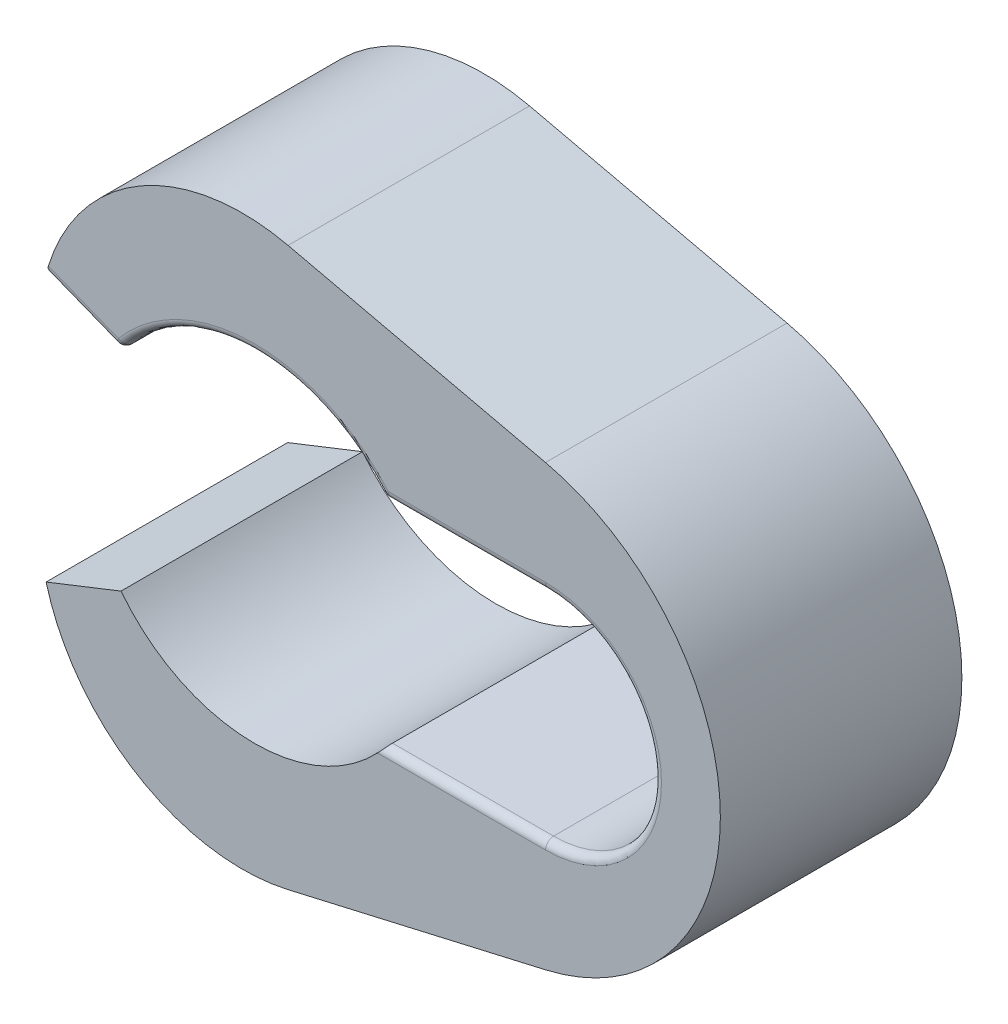
ISO-10303-21;
HEADER;
FILE_DESCRIPTION(('STEP AP214'),'2;1');
FILE_NAME('part.step','',(''),(''),'','','');
FILE_SCHEMA(('AUTOMOTIVE_DESIGN { 1 0 10303 214 1 1 1 1 }'));
ENDSEC;
DATA;
#1=APPLICATION_CONTEXT('core data for automotive mechanical design processes');
#2=APPLICATION_PROTOCOL_DEFINITION('international standard','automotive_design',2000,#1);
#3=PRODUCT_CONTEXT('',#1,'mechanical');
#4=PRODUCT('Part','Part','',(#3));
#5=PRODUCT_RELATED_PRODUCT_CATEGORY('part','',(#4));
#6=PRODUCT_DEFINITION_FORMATION('','',#4);
#7=PRODUCT_DEFINITION_CONTEXT('part definition',#1,'design');
#8=PRODUCT_DEFINITION('design','',#6,#7);
#9=PRODUCT_DEFINITION_SHAPE('','',#8);
#10=(LENGTH_UNIT() NAMED_UNIT(*) SI_UNIT(.MILLI.,.METRE.));
#11=(NAMED_UNIT(*) PLANE_ANGLE_UNIT() SI_UNIT($,.RADIAN.));
#12=(NAMED_UNIT(*) SI_UNIT($,.STERADIAN.) SOLID_ANGLE_UNIT());
#13=UNCERTAINTY_MEASURE_WITH_UNIT(LENGTH_MEASURE(1.E-05),#10,'distance_accuracy_value','');
#14=(GEOMETRIC_REPRESENTATION_CONTEXT(3) GLOBAL_UNCERTAINTY_ASSIGNED_CONTEXT((#13)) GLOBAL_UNIT_ASSIGNED_CONTEXT((#10,
#11,#12)) REPRESENTATION_CONTEXT('',''));
#15=CARTESIAN_POINT('',(0.,0.,0.));
#16=DIRECTION('',(0.,0.,1.));
#17=DIRECTION('',(1.,0.,0.));
#18=AXIS2_PLACEMENT_3D('',#15,#16,#17);
#19=CARTESIAN_POINT('',(0.,0.,15.));
#20=DIRECTION('',(0.,0.,-1.));
#21=DIRECTION('',(-1.,0.,0.));
#22=AXIS2_PLACEMENT_3D('',#19,#20,#21);
#23=CYLINDRICAL_SURFACE('',#22,10.5);
#24=CARTESIAN_POINT('',(0.,0.,14.5));
#25=DIRECTION('',(0.,0.,-1.));
#26=DIRECTION('',(-1.,0.,0.));
#27=AXIS2_PLACEMENT_3D('',#24,#25,#26);
#28=CIRCLE('',#27,10.5);
#29=CARTESIAN_POINT('',(7.93823782931141,6.87272727272728,14.5));
#30=VERTEX_POINT('',#29);
#31=CARTESIAN_POINT('',(-8.05579356416953,6.73455195625402,14.5));
#32=VERTEX_POINT('',#31);
#33=EDGE_CURVE('E43',#30,#32,#28,.F.);
#34=ORIENTED_EDGE('',*,*,#33,.T.);
#35=DIRECTION('',(0.,0.,-1.));
#36=VECTOR('',#35,1.);
#37=CARTESIAN_POINT('',(-8.05579356416953,6.73455195625402,15.));
#38=LINE('',#37,#36);
#39=CARTESIAN_POINT('',(-8.05579356416953,6.73455195625402,0.5));
#40=VERTEX_POINT('',#39);
#41=EDGE_CURVE('E11',#32,#40,#38,.T.);
#42=ORIENTED_EDGE('',*,*,#41,.T.);
#43=CARTESIAN_POINT('',(0.,0.,0.5));
#44=DIRECTION('',(0.,0.,-1.));
#45=DIRECTION('',(-1.,0.,0.));
#46=AXIS2_PLACEMENT_3D('',#43,#44,#45);
#47=CIRCLE('',#46,10.5);
#48=CARTESIAN_POINT('',(7.93823782931141,6.87272727272728,0.5));
#49=VERTEX_POINT('',#48);
#50=EDGE_CURVE('E335',#40,#49,#47,.T.);
#51=ORIENTED_EDGE('',*,*,#50,.T.);
#52=DIRECTION('',(0.,0.,-1.));
#53=VECTOR('',#52,1.);
#54=CARTESIAN_POINT('',(7.93823782931141,6.87272727272728,15.));
#55=LINE('',#54,#53);
#56=EDGE_CURVE('E54',#49,#30,#55,.F.);
#57=ORIENTED_EDGE('',*,*,#56,.T.);
#58=EDGE_LOOP('',(#34,#42,#51,#57));
#59=FACE_BOUND('',#58,.T.);
#60=ADVANCED_FACE('F33',(#59),#23,.F.);
#61=CARTESIAN_POINT('',(8.08455317256309,6.7,15.));
#62=DIRECTION('',(0.,1.,0.));
#63=DIRECTION('',(0.,0.,1.));
#64=AXIS2_PLACEMENT_3D('',#61,#62,#63);
#65=PLANE('',#64);
#66=DIRECTION('',(0.,0.,-1.));
#67=VECTOR('',#66,1.);
#68=CARTESIAN_POINT('',(18.0845531725631,6.7,15.));
#69=LINE('',#68,#67);
#70=CARTESIAN_POINT('',(18.0845531725631,6.7,14.5));
#71=VERTEX_POINT('',#70);
#72=CARTESIAN_POINT('',(18.0845531725631,6.7,0.5));
#73=VERTEX_POINT('',#72);
#74=EDGE_CURVE('E244',#71,#73,#69,.T.);
#75=ORIENTED_EDGE('',*,*,#74,.F.);
#76=DIRECTION('',(1.,0.,0.));
#77=VECTOR('',#76,1.);
#78=CARTESIAN_POINT('',(8.08455317256309,6.7,14.5));
#79=LINE('',#78,#77);
#80=CARTESIAN_POINT('',(8.31624915451671,6.7,14.5));
#81=VERTEX_POINT('',#80);
#82=EDGE_CURVE('E437',#71,#81,#79,.F.);
#83=ORIENTED_EDGE('',*,*,#82,.T.);
#84=DIRECTION('',(0.,0.,-1.));
#85=VECTOR('',#84,1.);
#86=CARTESIAN_POINT('',(8.31624915451671,6.7,15.));
#87=LINE('',#86,#85);
#88=CARTESIAN_POINT('',(8.31624915451671,6.7,0.5));
#89=VERTEX_POINT('',#88);
#90=EDGE_CURVE('E433',#81,#89,#87,.T.);
#91=ORIENTED_EDGE('',*,*,#90,.T.);
#92=DIRECTION('',(1.,0.,0.));
#93=VECTOR('',#92,1.);
#94=CARTESIAN_POINT('',(18.0845531725631,6.7,0.5));
#95=LINE('',#94,#93);
#96=EDGE_CURVE('E435',#89,#73,#95,.T.);
#97=ORIENTED_EDGE('',*,*,#96,.T.);
#98=EDGE_LOOP('',(#75,#83,#91,#97));
#99=FACE_BOUND('',#98,.T.);
#100=ADVANCED_FACE('F281',(#99),#65,.F.);
#101=CARTESIAN_POINT('',(18.0845531725631,0.,15.));
#102=DIRECTION('',(0.,0.,-1.));
#103=DIRECTION('',(-1.,0.,0.));
#104=AXIS2_PLACEMENT_3D('',#101,#102,#103);
#105=CYLINDRICAL_SURFACE('',#104,6.7);
#106=DIRECTION('',(0.,0.,-1.));
#107=VECTOR('',#106,1.);
#108=CARTESIAN_POINT('',(18.0845531725631,-6.7,15.));
#109=LINE('',#108,#107);
#110=CARTESIAN_POINT('',(18.0845531725631,-6.7,14.5));
#111=VERTEX_POINT('',#110);
#112=CARTESIAN_POINT('',(18.0845531725631,-6.7,0.5));
#113=VERTEX_POINT('',#112);
#114=EDGE_CURVE('E241',#111,#113,#109,.T.);
#115=ORIENTED_EDGE('',*,*,#114,.F.);
#116=CARTESIAN_POINT('',(18.0845531725631,0.,14.5));
#117=DIRECTION('',(0.,0.,-1.));
#118=DIRECTION('',(-1.,0.,0.));
#119=AXIS2_PLACEMENT_3D('',#116,#117,#118);
#120=CIRCLE('',#119,6.7);
#121=EDGE_CURVE('E424',#111,#71,#120,.F.);
#122=ORIENTED_EDGE('',*,*,#121,.T.);
#123=ORIENTED_EDGE('',*,*,#74,.T.);
#124=CARTESIAN_POINT('',(18.0845531725631,0.,0.5));
#125=DIRECTION('',(0.,0.,-1.));
#126=DIRECTION('',(-1.,0.,0.));
#127=AXIS2_PLACEMENT_3D('',#124,#125,#126);
#128=CIRCLE('',#127,6.7);
#129=EDGE_CURVE('E411',#73,#113,#128,.T.);
#130=ORIENTED_EDGE('',*,*,#129,.T.);
#131=EDGE_LOOP('',(#115,#122,#123,#130));
#132=FACE_BOUND('',#131,.T.);
#133=ADVANCED_FACE('F277',(#132),#105,.F.);
#134=CARTESIAN_POINT('',(8.0845531725631,-6.7,15.));
#135=DIRECTION('',(0.,-1.,0.));
#136=DIRECTION('',(1.,0.,0.));
#137=AXIS2_PLACEMENT_3D('',#134,#135,#136);
#138=PLANE('',#137);
#139=DIRECTION('',(0.,0.,-1.));
#140=VECTOR('',#139,1.);
#141=CARTESIAN_POINT('',(8.08455317256309,-6.70000000000001,15.));
#142=LINE('',#141,#140);
#143=CARTESIAN_POINT('',(8.08455317256309,-6.70000000000001,14.5));
#144=VERTEX_POINT('',#143);
#145=CARTESIAN_POINT('',(8.08455317256309,-6.70000000000001,0.5));
#146=VERTEX_POINT('',#145);
#147=EDGE_CURVE('E194',#144,#146,#142,.T.);
#148=ORIENTED_EDGE('',*,*,#147,.F.);
#149=DIRECTION('',(-1.,0.,0.));
#150=VECTOR('',#149,1.);
#151=CARTESIAN_POINT('',(8.0845531725631,-6.7,14.5));
#152=LINE('',#151,#150);
#153=EDGE_CURVE('E420',#144,#111,#152,.F.);
#154=ORIENTED_EDGE('',*,*,#153,.T.);
#155=ORIENTED_EDGE('',*,*,#114,.T.);
#156=DIRECTION('',(-1.,0.,0.));
#157=VECTOR('',#156,1.);
#158=CARTESIAN_POINT('',(8.08455317256309,-6.7,0.5));
#159=LINE('',#158,#157);
#160=EDGE_CURVE('E418',#113,#146,#159,.T.);
#161=ORIENTED_EDGE('',*,*,#160,.T.);
#162=EDGE_LOOP('',(#148,#154,#155,#161));
#163=FACE_BOUND('',#162,.T.);
#164=ADVANCED_FACE('F272',(#163),#138,.F.);
#165=CARTESIAN_POINT('',(0.,0.,15.));
#166=DIRECTION('',(0.,0.,-1.));
#167=DIRECTION('',(-1.,0.,0.));
#168=AXIS2_PLACEMENT_3D('',#165,#166,#167);
#169=CYLINDRICAL_SURFACE('',#168,10.5);
#170=CARTESIAN_POINT('',(0.,0.,15.));
#171=DIRECTION('',(0.,0.,-1.));
#172=DIRECTION('',(1.,0.,0.));
#173=AXIS2_PLACEMENT_3D('',#170,#171,#172);
#174=CIRCLE('',#173,10.5);
#175=CARTESIAN_POINT('',(7.6426435217142,-7.2,15.));
#176=VERTEX_POINT('',#175);
#177=CARTESIAN_POINT('',(-8.28130836625724,-6.45522515044657,15.));
#178=VERTEX_POINT('',#177);
#179=EDGE_CURVE('E176',#176,#178,#174,.T.);
#180=ORIENTED_EDGE('',*,*,#179,.F.);
#181=CARTESIAN_POINT('',(7.6426435217142,-7.2,15.));
#182=CARTESIAN_POINT('',(7.67145457104155,-7.16942996802068,14.999977280342));
#183=CARTESIAN_POINT('',(7.70012696283523,-7.13861534813409,14.9971906104281));
#184=CARTESIAN_POINT('',(7.75677183624732,-7.07701966692438,14.9856673290246));
#185=CARTESIAN_POINT('',(7.78473708628821,-7.04624075461462,14.9768843342326));
#186=CARTESIAN_POINT('',(7.83625956917391,-6.98887515371483,14.9541749552461));
#187=CARTESIAN_POINT('',(7.85997333778086,-6.96218447579508,14.9408756179153));
#188=CARTESIAN_POINT('',(7.90542638702153,-6.9105287255696,14.9088117622525));
#189=CARTESIAN_POINT('',(7.92717103595549,-6.88555900887289,14.8900627278632));
#190=CARTESIAN_POINT('',(7.96327886611879,-6.84373990013145,14.8516998615106));
#191=CARTESIAN_POINT('',(7.9782020575658,-6.82632752327069,14.8332297678906));
#192=CARTESIAN_POINT('',(8.00583793064208,-6.79389514958017,14.7928271969774));
#193=CARTESIAN_POINT('',(8.01855249611813,-6.77887311483652,14.7708977011523));
#194=CARTESIAN_POINT('',(8.03917576639338,-6.75439594752188,14.7279003040597));
#195=CARTESIAN_POINT('',(8.04753551746968,-6.74442718464261,14.7073424707738));
#196=CARTESIAN_POINT('',(8.06192148113246,-6.72722435640947,14.6643686331708));
#197=CARTESIAN_POINT('',(8.06795188770199,-6.71998537664666,14.6419560575341));
#198=CARTESIAN_POINT('',(8.07654649557036,-6.70965246487634,14.5997339233324));
#199=CARTESIAN_POINT('',(8.07952567161257,-6.70606308293382,14.5801295703303));
#200=CARTESIAN_POINT('',(8.08354023935213,-6.70122226116396,14.5403596879494));
#201=CARTESIAN_POINT('',(8.08456760743836,-6.69998047206649,14.52019218648));
#202=CARTESIAN_POINT('',(8.08455317256309,-6.7,14.5));
#203=B_SPLINE_CURVE_WITH_KNOTS('',3,(#181,#182,#183,#184,#185,#186,#187,#188,#189,#190,#191,
#192,#193,#194,#195,#196,#197,#198,#199,#200,#201,#202),.UNSPECIFIED.,.F.,.F.,(4,2,2,2,2,2,2,2,
2,2,4),(0.,0.126064658014748,0.253115678898471,0.367005597267162,0.480575037395884,
0.568591487515284,0.656532491416228,0.729223194543934,0.801782401167014,0.862006614552694,
0.922477870076368),.UNSPECIFIED.);
#204=EDGE_CURVE('E262',#176,#144,#203,.T.);
#205=ORIENTED_EDGE('',*,*,#204,.T.);
#206=ORIENTED_EDGE('',*,*,#147,.T.);
#207=CARTESIAN_POINT('',(8.08455317256309,-6.7,0.5));
#208=CARTESIAN_POINT('',(8.08458037578323,-6.69996348631527,0.476509477331905));
#209=CARTESIAN_POINT('',(8.08318341593196,-6.70165287219748,0.453060772565229));
#210=CARTESIAN_POINT('',(8.07777138201821,-6.70817709876669,0.407069745262832));
#211=CARTESIAN_POINT('',(8.07377377472908,-6.71299095403427,0.384522433477553));
#212=CARTESIAN_POINT('',(8.06339442082013,-6.72545399488196,0.340865342524354));
#213=CARTESIAN_POINT('',(8.05701687786426,-6.73309818108317,0.31975310586245));
#214=CARTESIAN_POINT('',(8.0421968383729,-6.75079286507141,0.279317490257493));
#215=CARTESIAN_POINT('',(8.03375089617154,-6.76084737753071,0.259997171217162));
#216=CARTESIAN_POINT('',(8.01221925809003,-6.78636121775907,0.217708647155055));
#217=CARTESIAN_POINT('',(7.9985082959306,-6.80252786022017,0.195485346296694));
#218=CARTESIAN_POINT('',(7.96880902896444,-6.83729535901345,0.154798355422256));
#219=CARTESIAN_POINT('',(7.95281762975984,-6.85589952005958,0.136339858078292));
#220=CARTESIAN_POINT('',(7.91399861000451,-6.90070619924002,0.0980856862502893));
#221=CARTESIAN_POINT('',(7.89057147274189,-6.92749822390498,0.0795922216383028));
#222=CARTESIAN_POINT('',(7.84174153441776,-6.98272562337612,0.0485595516525926));
#223=CARTESIAN_POINT('',(7.81633428783464,-7.01116465684693,0.0360342211257642));
#224=CARTESIAN_POINT('',(7.76638708297808,-7.06643475877294,0.0173593490184483));
#225=CARTESIAN_POINT('',(7.74194310924323,-7.09320991035824,0.0107761663891884));
#226=CARTESIAN_POINT('',(7.69258461067551,-7.14671121976606,0.00211955409466551));
#227=CARTESIAN_POINT('',(7.66767457678755,-7.17343640883009,1.48823626316069E-05));
#228=CARTESIAN_POINT('',(7.6426435217142,-7.2,0.));
#229=B_SPLINE_CURVE_WITH_KNOTS('',3,(#207,#208,#209,#210,#211,#212,#213,#214,#215,#216,#217,
#218,#219,#220,#221,#222,#223,#224,#225,#226,#227,#228),.UNSPECIFIED.,.F.,.F.,(4,2,2,2,2,2,2,2,
2,2,4),(0.,0.0703032742388482,0.140139177371983,0.20985230921604,0.279682372990529,
0.371318734345133,0.463080644574803,0.582764627529044,0.702725512969597,0.812986647473504,
0.922476044589817),.UNSPECIFIED.);
#230=CARTESIAN_POINT('',(7.6426435217142,-7.2,0.));
#231=VERTEX_POINT('',#230);
#232=EDGE_CURVE('E256',#146,#231,#229,.T.);
#233=ORIENTED_EDGE('',*,*,#232,.T.);
#234=CARTESIAN_POINT('',(0.,0.,0.));
#235=DIRECTION('',(0.,0.,-1.));
#236=DIRECTION('',(1.,0.,0.));
#237=AXIS2_PLACEMENT_3D('',#234,#235,#236);
#238=CIRCLE('',#237,10.5);
#239=CARTESIAN_POINT('',(-8.28130836625724,-6.45522515044657,0.));
#240=VERTEX_POINT('',#239);
#241=EDGE_CURVE('E191',#231,#240,#238,.T.);
#242=ORIENTED_EDGE('',*,*,#241,.T.);
#243=DIRECTION('',(0.,0.,-1.));
#244=VECTOR('',#243,1.);
#245=CARTESIAN_POINT('',(-8.28130836625724,-6.45522515044657,15.));
#246=LINE('',#245,#244);
#247=EDGE_CURVE('E188',#178,#240,#246,.T.);
#248=ORIENTED_EDGE('',*,*,#247,.F.);
#249=EDGE_LOOP('',(#180,#205,#206,#233,#242,#248));
#250=FACE_BOUND('',#249,.T.);
#251=ADVANCED_FACE('F189',(#250),#169,.F.);
#252=CARTESIAN_POINT('',(-8.28130836625724,-6.45522515044657,15.));
#253=DIRECTION('',(0.367329900760933,-0.930090718159774,0.));
#254=DIRECTION('',(0.930090718159774,0.367329900760933,0.));
#255=AXIS2_PLACEMENT_3D('',#252,#253,#254);
#256=PLANE('',#255);
#257=DIRECTION('',(-0.930090718159773,-0.367329900760933,0.));
#258=VECTOR('',#257,1.);
#259=CARTESIAN_POINT('',(-8.28130836625724,-6.45522515044657,0.));
#260=LINE('',#259,#258);
#261=CARTESIAN_POINT('',(-12.9317619570561,-8.29187465425124,0.));
#262=VERTEX_POINT('',#261);
#263=EDGE_CURVE('E215',#240,#262,#260,.T.);
#264=ORIENTED_EDGE('',*,*,#263,.T.);
#265=DIRECTION('',(0.,0.,-1.));
#266=VECTOR('',#265,1.);
#267=CARTESIAN_POINT('',(-12.9317619570561,-8.29187465425124,15.));
#268=LINE('',#267,#266);
#269=CARTESIAN_POINT('',(-12.9317619570561,-8.29187465425124,15.));
#270=VERTEX_POINT('',#269);
#271=EDGE_CURVE('E195',#270,#262,#268,.T.);
#272=ORIENTED_EDGE('',*,*,#271,.F.);
#273=DIRECTION('',(-0.930090718159773,-0.367329900760933,0.));
#274=VECTOR('',#273,1.);
#275=CARTESIAN_POINT('',(-8.28130836625724,-6.45522515044657,15.));
#276=LINE('',#275,#274);
#277=EDGE_CURVE('E180',#178,#270,#276,.T.);
#278=ORIENTED_EDGE('',*,*,#277,.F.);
#279=ORIENTED_EDGE('',*,*,#247,.T.);
#280=EDGE_LOOP('',(#264,#272,#278,#279));
#281=FACE_BOUND('',#280,.T.);
#282=ADVANCED_FACE('F197',(#281),#256,.F.);
#283=CARTESIAN_POINT('',(-0.739697046897969,-5.02607362365075,15.));
#284=DIRECTION('',(0.,0.,-1.));
#285=DIRECTION('',(-1.,0.,0.));
#286=AXIS2_PLACEMENT_3D('',#283,#284,#285);
#287=CYLINDRICAL_SURFACE('',#286,12.6218819177245);
#288=CARTESIAN_POINT('',(-0.739697046897969,-5.02607362365075,0.));
#289=DIRECTION('',(0.,0.,1.));
#290=DIRECTION('',(-1.,0.,0.));
#291=AXIS2_PLACEMENT_3D('',#288,#289,#290);
#292=CIRCLE('',#291,12.6218819177245);
#293=CARTESIAN_POINT('',(2.0931964355167,-17.3259361294787,0.));
#294=VERTEX_POINT('',#293);
#295=EDGE_CURVE('E217',#262,#294,#292,.T.);
#296=ORIENTED_EDGE('',*,*,#295,.T.);
#297=DIRECTION('',(0.,0.,-1.));
#298=VECTOR('',#297,1.);
#299=CARTESIAN_POINT('',(2.0931964355167,-17.3259361294787,15.));
#300=LINE('',#299,#298);
#301=CARTESIAN_POINT('',(2.0931964355167,-17.3259361294787,15.));
#302=VERTEX_POINT('',#301);
#303=EDGE_CURVE('E235',#302,#294,#300,.T.);
#304=ORIENTED_EDGE('',*,*,#303,.F.);
#305=CARTESIAN_POINT('',(-0.739697046897969,-5.02607362365075,15.));
#306=DIRECTION('',(0.,0.,1.));
#307=DIRECTION('',(-1.,0.,0.));
#308=AXIS2_PLACEMENT_3D('',#305,#306,#307);
#309=CIRCLE('',#308,12.6218819177245);
#310=EDGE_CURVE('E200',#270,#302,#309,.T.);
#311=ORIENTED_EDGE('',*,*,#310,.F.);
#312=ORIENTED_EDGE('',*,*,#271,.T.);
#313=EDGE_LOOP('',(#296,#304,#311,#312));
#314=FACE_BOUND('',#313,.T.);
#315=ADVANCED_FACE('F521',(#314),#287,.T.);
#316=CARTESIAN_POINT('',(2.0931964355167,-17.3259361294787,15.));
#317=DIRECTION('',(-0.224443034793134,0.974487210861614,0.));
#318=DIRECTION('',(-0.974487210861614,-0.224443034793134,0.));
#319=AXIS2_PLACEMENT_3D('',#316,#317,#318);
#320=PLANE('',#319);
#321=DIRECTION('',(0.974487210861614,0.224443034793134,0.));
#322=VECTOR('',#321,1.);
#323=CARTESIAN_POINT('',(2.0931964355167,-17.3259361294787,0.));
#324=LINE('',#323,#322);
#325=CARTESIAN_POINT('',(18.0845531725631,-13.6428209520626,0.));
#326=VERTEX_POINT('',#325);
#327=EDGE_CURVE('E219',#294,#326,#324,.T.);
#328=ORIENTED_EDGE('',*,*,#327,.T.);
#329=DIRECTION('',(0.,0.,-1.));
#330=VECTOR('',#329,1.);
#331=CARTESIAN_POINT('',(18.0845531725631,-13.6428209520626,15.));
#332=LINE('',#331,#330);
#333=CARTESIAN_POINT('',(18.0845531725631,-13.6428209520626,15.));
#334=VERTEX_POINT('',#333);
#335=EDGE_CURVE('E232',#334,#326,#332,.T.);
#336=ORIENTED_EDGE('',*,*,#335,.F.);
#337=DIRECTION('',(0.974487210861614,0.224443034793134,0.));
#338=VECTOR('',#337,1.);
#339=CARTESIAN_POINT('',(2.0931964355167,-17.3259361294787,15.));
#340=LINE('',#339,#338);
#341=EDGE_CURVE('E202',#302,#334,#340,.T.);
#342=ORIENTED_EDGE('',*,*,#341,.F.);
#343=ORIENTED_EDGE('',*,*,#303,.T.);
#344=EDGE_LOOP('',(#328,#336,#342,#343));
#345=FACE_BOUND('',#344,.T.);
#346=ADVANCED_FACE('F528',(#345),#320,.F.);
#347=CARTESIAN_POINT('',(14.9423506854592,0.,15.));
#348=DIRECTION('',(0.,0.,-1.));
#349=DIRECTION('',(-1.,0.,0.));
#350=AXIS2_PLACEMENT_3D('',#347,#348,#349);
#351=CYLINDRICAL_SURFACE('',#350,14.);
#352=CARTESIAN_POINT('',(14.9423506854592,0.,0.));
#353=DIRECTION('',(0.,0.,1.));
#354=DIRECTION('',(-1.,0.,0.));
#355=AXIS2_PLACEMENT_3D('',#352,#353,#354);
#356=CIRCLE('',#355,14.);
#357=CARTESIAN_POINT('',(18.0845531725631,13.6428209520626,0.));
#358=VERTEX_POINT('',#357);
#359=EDGE_CURVE('E221',#326,#358,#356,.T.);
#360=ORIENTED_EDGE('',*,*,#359,.T.);
#361=DIRECTION('',(0.,0.,-1.));
#362=VECTOR('',#361,1.);
#363=CARTESIAN_POINT('',(18.0845531725631,13.6428209520626,15.));
#364=LINE('',#363,#362);
#365=CARTESIAN_POINT('',(18.0845531725631,13.6428209520626,15.));
#366=VERTEX_POINT('',#365);
#367=EDGE_CURVE('E229',#366,#358,#364,.T.);
#368=ORIENTED_EDGE('',*,*,#367,.F.);
#369=CARTESIAN_POINT('',(14.9423506854592,0.,15.));
#370=DIRECTION('',(0.,0.,1.));
#371=DIRECTION('',(-1.,0.,0.));
#372=AXIS2_PLACEMENT_3D('',#369,#370,#371);
#373=CIRCLE('',#372,14.);
#374=EDGE_CURVE('E206',#334,#366,#373,.T.);
#375=ORIENTED_EDGE('',*,*,#374,.F.);
#376=ORIENTED_EDGE('',*,*,#335,.T.);
#377=EDGE_LOOP('',(#360,#368,#375,#376));
#378=FACE_BOUND('',#377,.T.);
#379=ADVANCED_FACE('F531',(#378),#351,.T.);
#380=CARTESIAN_POINT('',(2.0931964355167,17.3259361294787,15.));
#381=DIRECTION('',(-0.224443034793134,-0.974487210861614,0.));
#382=DIRECTION('',(0.974487210861614,-0.224443034793134,0.));
#383=AXIS2_PLACEMENT_3D('',#380,#381,#382);
#384=PLANE('',#383);
#385=DIRECTION('',(-0.974487210861614,0.224443034793134,0.));
#386=VECTOR('',#385,1.);
#387=CARTESIAN_POINT('',(2.0931964355167,17.3259361294787,0.));
#388=LINE('',#387,#386);
#389=CARTESIAN_POINT('',(2.09319643551671,17.3259361294787,0.));
#390=VERTEX_POINT('',#389);
#391=EDGE_CURVE('E223',#358,#390,#388,.T.);
#392=ORIENTED_EDGE('',*,*,#391,.T.);
#393=DIRECTION('',(0.,0.,-1.));
#394=VECTOR('',#393,1.);
#395=CARTESIAN_POINT('',(2.09319643551671,17.3259361294787,15.));
#396=LINE('',#395,#394);
#397=CARTESIAN_POINT('',(2.09319643551671,17.3259361294787,15.));
#398=VERTEX_POINT('',#397);
#399=EDGE_CURVE('E213',#398,#390,#396,.T.);
#400=ORIENTED_EDGE('',*,*,#399,.F.);
#401=DIRECTION('',(-0.974487210861614,0.224443034793134,0.));
#402=VECTOR('',#401,1.);
#403=CARTESIAN_POINT('',(2.0931964355167,17.3259361294787,15.));
#404=LINE('',#403,#402);
#405=EDGE_CURVE('E208',#366,#398,#404,.T.);
#406=ORIENTED_EDGE('',*,*,#405,.F.);
#407=ORIENTED_EDGE('',*,*,#367,.T.);
#408=EDGE_LOOP('',(#392,#400,#406,#407));
#409=FACE_BOUND('',#408,.T.);
#410=ADVANCED_FACE('F345',(#409),#384,.F.);
#411=CARTESIAN_POINT('',(-0.739697046897969,5.02607362365075,15.));
#412=DIRECTION('',(0.,0.,-1.));
#413=DIRECTION('',(-1.,0.,0.));
#414=AXIS2_PLACEMENT_3D('',#411,#412,#413);
#415=CYLINDRICAL_SURFACE('',#414,12.6218819177245);
#416=DIRECTION('',(0.,0.,-1.));
#417=VECTOR('',#416,1.);
#418=CARTESIAN_POINT('',(-12.8036876798747,8.73714262764808,15.));
#419=LINE('',#418,#417);
#420=CARTESIAN_POINT('',(-12.8036876798747,8.73714262764808,0.00150887155019215));
#421=VERTEX_POINT('',#420);
#422=CARTESIAN_POINT('',(-12.8036876798747,8.73714262764808,14.9984911284498));
#423=VERTEX_POINT('',#422);
#424=EDGE_CURVE('E336',#421,#423,#419,.F.);
#425=ORIENTED_EDGE('',*,*,#424,.T.);
#426=CARTESIAN_POINT('',(-12.8036876798747,8.73714262764808,14.9984911284498));
#427=CARTESIAN_POINT('',(-12.8017829761243,8.74333451406577,14.9989939633457));
#428=CARTESIAN_POINT('',(-12.7998720538441,8.74952957615502,14.9993711200895));
#429=CARTESIAN_POINT('',(-12.796037772224,8.76192605167667,14.9998740772729));
#430=CARTESIAN_POINT('',(-12.7941144128842,8.76812746510907,14.9999998777125));
#431=CARTESIAN_POINT('',(-12.7921848350146,8.77433205421304,15.));
#432=B_SPLINE_CURVE_WITH_KNOTS('',3,(#426,#427,#428,#429,#430,#431),.UNSPECIFIED.,.F.,.F.,(4,2,
4),(0.,0.0194821453937151,0.0389642907874283),.UNSPECIFIED.);
#433=CARTESIAN_POINT('',(-12.7921848350146,8.77433205421304,15.));
#434=VERTEX_POINT('',#433);
#435=EDGE_CURVE('E328',#423,#434,#432,.T.);
#436=ORIENTED_EDGE('',*,*,#435,.T.);
#437=CARTESIAN_POINT('',(-0.739697046897969,5.02607362365075,15.));
#438=DIRECTION('',(0.,0.,1.));
#439=DIRECTION('',(1.,0.,0.));
#440=AXIS2_PLACEMENT_3D('',#437,#438,#439);
#441=CIRCLE('',#440,12.6218819177245);
#442=EDGE_CURVE('E210',#398,#434,#441,.T.);
#443=ORIENTED_EDGE('',*,*,#442,.F.);
#444=ORIENTED_EDGE('',*,*,#399,.T.);
#445=CARTESIAN_POINT('',(-0.739697046897969,5.02607362365075,0.));
#446=DIRECTION('',(0.,0.,1.));
#447=DIRECTION('',(1.,0.,0.));
#448=AXIS2_PLACEMENT_3D('',#445,#446,#447);
#449=CIRCLE('',#448,12.6218819177245);
#450=CARTESIAN_POINT('',(-12.7921848350145,8.77433205421304,0.));
#451=VERTEX_POINT('',#450);
#452=EDGE_CURVE('E185',#390,#451,#449,.T.);
#453=ORIENTED_EDGE('',*,*,#452,.T.);
#454=CARTESIAN_POINT('',(-12.7921848350145,8.77433205421304,0.));
#455=CARTESIAN_POINT('',(-12.7941144128842,8.76812746510907,1.22287527018651E-07));
#456=CARTESIAN_POINT('',(-12.796037772224,8.76192605167667,0.000125922727139839));
#457=CARTESIAN_POINT('',(-12.7998720538441,8.74952957615502,0.00062887991053708));
#458=CARTESIAN_POINT('',(-12.8017829761243,8.74333451406576,0.0010060366543215));
#459=CARTESIAN_POINT('',(-12.8036876798747,8.73714262764808,0.00150887155019172));
#460=B_SPLINE_CURVE_WITH_KNOTS('',3,(#454,#455,#456,#457,#458,#459),.UNSPECIFIED.,.F.,.F.,(4,2,
4),(0.,0.0194821453937159,0.0389642907874316),.UNSPECIFIED.);
#461=EDGE_CURVE('E350',#451,#421,#460,.T.);
#462=ORIENTED_EDGE('',*,*,#461,.T.);
#463=EDGE_LOOP('',(#425,#436,#443,#444,#453,#462));
#464=FACE_BOUND('',#463,.T.);
#465=ADVANCED_FACE('F339',(#464),#415,.T.);
#466=CARTESIAN_POINT('',(-8.28130836625724,6.45522515044656,15.));
#467=DIRECTION('',(0.367329900760933,0.930090718159774,0.));
#468=DIRECTION('',(-0.930090718159774,0.367329900760933,0.));
#469=AXIS2_PLACEMENT_3D('',#466,#467,#468);
#470=PLANE('',#469);
#471=DIRECTION('',(0.930090718159774,-0.367329900760933,0.));
#472=VECTOR('',#471,1.);
#473=CARTESIAN_POINT('',(-8.28130836625724,6.45522515044656,14.5));
#474=LINE('',#473,#472);
#475=CARTESIAN_POINT('',(-8.62306773189141,6.59019954747194,14.5));
#476=VERTEX_POINT('',#475);
#477=CARTESIAN_POINT('',(-12.5094527928294,8.12508793080906,14.5));
#478=VERTEX_POINT('',#477);
#479=EDGE_CURVE('E442',#476,#478,#474,.F.);
#480=ORIENTED_EDGE('',*,*,#479,.T.);
#481=DIRECTION('',(0.,0.,-1.));
#482=VECTOR('',#481,1.);
#483=CARTESIAN_POINT('',(-12.5094527928294,8.12508793080906,15.));
#484=LINE('',#483,#482);
#485=CARTESIAN_POINT('',(-12.5094527928294,8.12508793080906,0.5));
#486=VERTEX_POINT('',#485);
#487=EDGE_CURVE('E355',#478,#486,#484,.T.);
#488=ORIENTED_EDGE('',*,*,#487,.T.);
#489=DIRECTION('',(0.930090718159774,-0.367329900760933,0.));
#490=VECTOR('',#489,1.);
#491=CARTESIAN_POINT('',(-8.28130836625724,6.45522515044656,0.5));
#492=LINE('',#491,#490);
#493=CARTESIAN_POINT('',(-8.62306773189141,6.59019954747194,0.5));
#494=VERTEX_POINT('',#493);
#495=EDGE_CURVE('E441',#486,#494,#492,.T.);
#496=ORIENTED_EDGE('',*,*,#495,.T.);
#497=DIRECTION('',(0.,0.,-1.));
#498=VECTOR('',#497,1.);
#499=CARTESIAN_POINT('',(-8.62306773189141,6.59019954747194,15.));
#500=LINE('',#499,#498);
#501=EDGE_CURVE('E439',#494,#476,#500,.F.);
#502=ORIENTED_EDGE('',*,*,#501,.T.);
#503=EDGE_LOOP('',(#480,#488,#496,#502));
#504=FACE_BOUND('',#503,.T.);
#505=ADVANCED_FACE('F344',(#504),#470,.F.);
#506=CARTESIAN_POINT('',(0.,0.,15.));
#507=DIRECTION('',(0.,0.,-1.));
#508=DIRECTION('',(-1.,0.,0.));
#509=AXIS2_PLACEMENT_3D('',#506,#507,#508);
#510=PLANE('',#509);
#511=CARTESIAN_POINT('',(18.0845531725631,0.,15.));
#512=DIRECTION('',(0.,0.,-1.));
#513=DIRECTION('',(-1.,0.,0.));
#514=AXIS2_PLACEMENT_3D('',#511,#512,#513);
#515=CIRCLE('',#514,7.2);
#516=CARTESIAN_POINT('',(18.0845531725631,7.2,15.));
#517=VERTEX_POINT('',#516);
#518=CARTESIAN_POINT('',(18.0845531725631,-7.2,15.));
#519=VERTEX_POINT('',#518);
#520=EDGE_CURVE('E253',#517,#519,#515,.T.);
#521=ORIENTED_EDGE('',*,*,#520,.T.);
#522=DIRECTION('',(-1.,0.,0.));
#523=VECTOR('',#522,1.);
#524=CARTESIAN_POINT('',(0.,-7.20000000000001,15.));
#525=LINE('',#524,#523);
#526=EDGE_CURVE('E183',#519,#176,#525,.T.);
#527=ORIENTED_EDGE('',*,*,#526,.T.);
#528=ORIENTED_EDGE('',*,*,#179,.T.);
#529=ORIENTED_EDGE('',*,*,#277,.T.);
#530=ORIENTED_EDGE('',*,*,#310,.T.);
#531=ORIENTED_EDGE('',*,*,#341,.T.);
#532=ORIENTED_EDGE('',*,*,#374,.T.);
#533=ORIENTED_EDGE('',*,*,#405,.T.);
#534=ORIENTED_EDGE('',*,*,#442,.T.);
#535=DIRECTION('',(0.930090718159774,-0.367329900760933,0.));
#536=VECTOR('',#535,1.);
#537=CARTESIAN_POINT('',(1.27168613083324,3.21994878241698,15.));
#538=LINE('',#537,#536);
#539=CARTESIAN_POINT('',(-8.43940278151094,7.05524490655183,15.));
#540=VERTEX_POINT('',#539);
#541=EDGE_CURVE('E249',#434,#540,#538,.T.);
#542=ORIENTED_EDGE('',*,*,#541,.T.);
#543=CARTESIAN_POINT('',(0.,0.,15.));
#544=DIRECTION('',(0.,0.,-1.));
#545=DIRECTION('',(-1.,0.,0.));
#546=AXIS2_PLACEMENT_3D('',#543,#544,#545);
#547=CIRCLE('',#546,11.);
#548=CARTESIAN_POINT('',(8.31624915451671,7.2,15.));
#549=VERTEX_POINT('',#548);
#550=EDGE_CURVE('E247',#540,#549,#547,.T.);
#551=ORIENTED_EDGE('',*,*,#550,.T.);
#552=DIRECTION('',(1.,0.,0.));
#553=VECTOR('',#552,1.);
#554=CARTESIAN_POINT('',(0.,7.2,15.));
#555=LINE('',#554,#553);
#556=EDGE_CURVE('E251',#549,#517,#555,.T.);
#557=ORIENTED_EDGE('',*,*,#556,.T.);
#558=EDGE_LOOP('',(#521,#527,#528,#529,#530,#531,#532,#533,#534,#542,#551,#557));
#559=FACE_BOUND('',#558,.T.);
#560=ADVANCED_FACE('F178',(#559),#510,.F.);
#561=CARTESIAN_POINT('',(0.,0.,0.));
#562=DIRECTION('',(0.,0.,-1.));
#563=DIRECTION('',(-1.,0.,0.));
#564=AXIS2_PLACEMENT_3D('',#561,#562,#563);
#565=PLANE('',#564);
#566=ORIENTED_EDGE('',*,*,#241,.F.);
#567=DIRECTION('',(-1.,0.,0.));
#568=VECTOR('',#567,1.);
#569=CARTESIAN_POINT('',(18.0845531725631,-7.2,0.));
#570=LINE('',#569,#568);
#571=CARTESIAN_POINT('',(18.0845531725631,-7.2,0.));
#572=VERTEX_POINT('',#571);
#573=EDGE_CURVE('E417',#231,#572,#570,.F.);
#574=ORIENTED_EDGE('',*,*,#573,.T.);
#575=CARTESIAN_POINT('',(18.0845531725631,0.,0.));
#576=DIRECTION('',(0.,0.,-1.));
#577=DIRECTION('',(-1.,0.,0.));
#578=AXIS2_PLACEMENT_3D('',#575,#576,#577);
#579=CIRCLE('',#578,7.2);
#580=CARTESIAN_POINT('',(18.0845531725631,7.2,0.));
#581=VERTEX_POINT('',#580);
#582=EDGE_CURVE('E412',#572,#581,#579,.F.);
#583=ORIENTED_EDGE('',*,*,#582,.T.);
#584=DIRECTION('',(1.,0.,0.));
#585=VECTOR('',#584,1.);
#586=CARTESIAN_POINT('',(8.08455317256309,7.2,0.));
#587=LINE('',#586,#585);
#588=CARTESIAN_POINT('',(8.31624915451671,7.2,0.));
#589=VERTEX_POINT('',#588);
#590=EDGE_CURVE('E429',#581,#589,#587,.F.);
#591=ORIENTED_EDGE('',*,*,#590,.T.);
#592=CARTESIAN_POINT('',(0.,0.,0.));
#593=DIRECTION('',(0.,0.,-1.));
#594=DIRECTION('',(-1.,0.,0.));
#595=AXIS2_PLACEMENT_3D('',#592,#593,#594);
#596=CIRCLE('',#595,11.);
#597=CARTESIAN_POINT('',(-8.43940278151094,7.05524490655183,0.));
#598=VERTEX_POINT('',#597);
#599=EDGE_CURVE('E389',#589,#598,#596,.F.);
#600=ORIENTED_EDGE('',*,*,#599,.T.);
#601=DIRECTION('',(0.930090718159774,-0.367329900760933,0.));
#602=VECTOR('',#601,1.);
#603=CARTESIAN_POINT('',(-12.7480970066756,8.75692001333111,0.));
#604=LINE('',#603,#602);
#605=EDGE_CURVE('E427',#598,#451,#604,.F.);
#606=ORIENTED_EDGE('',*,*,#605,.T.);
#607=ORIENTED_EDGE('',*,*,#452,.F.);
#608=ORIENTED_EDGE('',*,*,#391,.F.);
#609=ORIENTED_EDGE('',*,*,#359,.F.);
#610=ORIENTED_EDGE('',*,*,#327,.F.);
#611=ORIENTED_EDGE('',*,*,#295,.F.);
#612=ORIENTED_EDGE('',*,*,#263,.F.);
#613=EDGE_LOOP('',(#566,#574,#583,#591,#600,#606,#607,#608,#609,#610,#611,#612));
#614=FACE_BOUND('',#613,.T.);
#615=ADVANCED_FACE('F506',(#614),#565,.T.);
#616=CARTESIAN_POINT('',(8.0845531725631,-7.2,0.5));
#617=DIRECTION('',(1.,0.,0.));
#618=DIRECTION('',(0.,1.,0.));
#619=AXIS2_PLACEMENT_3D('',#616,#617,#618);
#620=CYLINDRICAL_SURFACE('',#619,0.5);
#621=ORIENTED_EDGE('',*,*,#232,.F.);
#622=ORIENTED_EDGE('',*,*,#160,.F.);
#623=CARTESIAN_POINT('',(18.0845531725631,-7.2,0.5));
#624=DIRECTION('',(1.,0.,0.));
#625=DIRECTION('',(0.,0.,-1.));
#626=AXIS2_PLACEMENT_3D('',#623,#624,#625);
#627=CIRCLE('',#626,0.5);
#628=EDGE_CURVE('E38',#572,#113,#627,.T.);
#629=ORIENTED_EDGE('',*,*,#628,.F.);
#630=ORIENTED_EDGE('',*,*,#573,.F.);
#631=EDGE_LOOP('',(#621,#622,#629,#630));
#632=FACE_BOUND('',#631,.T.);
#633=ADVANCED_FACE('F35',(#632),#620,.T.);
#634=CARTESIAN_POINT('',(-8.09764341587677,6.92027050952645,0.5));
#635=DIRECTION('',(-0.930090718159774,0.367329900760933,0.));
#636=DIRECTION('',(-0.367329900760933,-0.930090718159774,0.));
#637=AXIS2_PLACEMENT_3D('',#634,#635,#636);
#638=CYLINDRICAL_SURFACE('',#637,0.5);
#639=ORIENTED_EDGE('',*,*,#461,.F.);
#640=ORIENTED_EDGE('',*,*,#605,.F.);
#641=CARTESIAN_POINT('',(-8.43940278151094,7.05524490655183,0.5));
#642=DIRECTION('',(0.930090718159773,-0.367329900760934,0.));
#643=DIRECTION('',(0.367329900760934,0.930090718159773,0.));
#644=AXIS2_PLACEMENT_3D('',#641,#642,#643);
#645=CIRCLE('',#644,0.5);
#646=EDGE_CURVE('E404',#494,#598,#645,.T.);
#647=ORIENTED_EDGE('',*,*,#646,.F.);
#648=ORIENTED_EDGE('',*,*,#495,.F.);
#649=CARTESIAN_POINT('',(-12.3257878424489,8.59013328988895,0.5));
#650=DIRECTION('',(-0.657673453929442,0.259741463760637,0.707106781186547));
#651=DIRECTION('',(-0.657673453929442,0.259741463760637,-0.707106781186547));
#652=AXIS2_PLACEMENT_3D('',#649,#650,#651);
#653=ELLIPSE('',#652,0.707106781186547,0.5);
#654=EDGE_CURVE('E398',#421,#486,#653,.T.);
#655=ORIENTED_EDGE('',*,*,#654,.F.);
#656=EDGE_LOOP('',(#639,#640,#647,#648,#655));
#657=FACE_BOUND('',#656,.T.);
#658=ADVANCED_FACE('F357',(#657),#638,.T.);
#659=CARTESIAN_POINT('',(18.0845531725631,0.,0.5));
#660=DIRECTION('',(0.,0.,-1.));
#661=DIRECTION('',(-1.,0.,0.));
#662=AXIS2_PLACEMENT_3D('',#659,#660,#661);
#663=TOROIDAL_SURFACE('',#662,7.2,0.5);
#664=ORIENTED_EDGE('',*,*,#628,.T.);
#665=ORIENTED_EDGE('',*,*,#129,.F.);
#666=CARTESIAN_POINT('',(18.0845531725631,7.2,0.5));
#667=DIRECTION('',(-1.,0.,0.));
#668=DIRECTION('',(0.,0.,1.));
#669=AXIS2_PLACEMENT_3D('',#666,#667,#668);
#670=CIRCLE('',#669,0.5);
#671=EDGE_CURVE('E394',#581,#73,#670,.T.);
#672=ORIENTED_EDGE('',*,*,#671,.F.);
#673=ORIENTED_EDGE('',*,*,#582,.F.);
#674=EDGE_LOOP('',(#664,#665,#672,#673));
#675=FACE_BOUND('',#674,.T.);
#676=ADVANCED_FACE('F361',(#675),#663,.T.);
#677=CARTESIAN_POINT('',(-8.43940278151094,7.05524490655183,0.5));
#678=DIRECTION('',(0.,0.,1.));
#679=DIRECTION('',(1.,0.,0.));
#680=AXIS2_PLACEMENT_3D('',#677,#678,#679);
#681=SPHERICAL_SURFACE('',#680,0.5);
#682=CARTESIAN_POINT('',(-8.43940278151093,7.05524490655183,0.5));
#683=DIRECTION('',(0.,0.,-1.));
#684=DIRECTION('',(-1.,0.,0.));
#685=AXIS2_PLACEMENT_3D('',#682,#683,#684);
#686=CIRCLE('',#685,0.5);
#687=EDGE_CURVE('E395',#494,#40,#686,.F.);
#688=ORIENTED_EDGE('',*,*,#687,.F.);
#689=ORIENTED_EDGE('',*,*,#646,.T.);
#690=CARTESIAN_POINT('',(-8.43940278151094,7.05524490655183,0.5));
#691=DIRECTION('',(-0.641385900595622,-0.767218434682811,0.));
#692=DIRECTION('',(0.767218434682811,-0.641385900595622,0.));
#693=AXIS2_PLACEMENT_3D('',#690,#691,#692);
#694=CIRCLE('',#693,0.5);
#695=EDGE_CURVE('E387',#40,#598,#694,.F.);
#696=ORIENTED_EDGE('',*,*,#695,.F.);
#697=EDGE_LOOP('',(#688,#689,#696));
#698=FACE_BOUND('',#697,.T.);
#699=ADVANCED_FACE('F365',(#698),#681,.T.);
#700=CARTESIAN_POINT('',(-12.3257878424489,8.59013328988895,15.));
#701=DIRECTION('',(0.,0.,-1.));
#702=DIRECTION('',(-1.,0.,0.));
#703=AXIS2_PLACEMENT_3D('',#700,#701,#702);
#704=CYLINDRICAL_SURFACE('',#703,0.5);
#705=ORIENTED_EDGE('',*,*,#654,.T.);
#706=ORIENTED_EDGE('',*,*,#487,.F.);
#707=CARTESIAN_POINT('',(-12.3257878424489,8.59013328988895,14.5));
#708=DIRECTION('',(0.657673453929442,-0.259741463760637,0.707106781186547));
#709=DIRECTION('',(0.657673453929442,-0.259741463760637,-0.707106781186547));
#710=AXIS2_PLACEMENT_3D('',#707,#708,#709);
#711=ELLIPSE('',#710,0.707106781186547,0.5);
#712=EDGE_CURVE('E400',#423,#478,#711,.T.);
#713=ORIENTED_EDGE('',*,*,#712,.F.);
#714=ORIENTED_EDGE('',*,*,#424,.F.);
#715=EDGE_LOOP('',(#705,#706,#713,#714));
#716=FACE_BOUND('',#715,.T.);
#717=ADVANCED_FACE('F369',(#716),#704,.T.);
#718=CARTESIAN_POINT('',(8.08455317256309,7.2,0.5));
#719=DIRECTION('',(-1.,0.,0.));
#720=DIRECTION('',(0.,0.,1.));
#721=AXIS2_PLACEMENT_3D('',#718,#719,#720);
#722=CYLINDRICAL_SURFACE('',#721,0.5);
#723=ORIENTED_EDGE('',*,*,#671,.T.);
#724=ORIENTED_EDGE('',*,*,#96,.F.);
#725=CARTESIAN_POINT('',(8.31624915451672,7.2,0.5));
#726=DIRECTION('',(-1.,0.,0.));
#727=DIRECTION('',(0.,-1.,0.));
#728=AXIS2_PLACEMENT_3D('',#725,#726,#727);
#729=CIRCLE('',#728,0.5);
#730=EDGE_CURVE('E456',#589,#89,#729,.T.);
#731=ORIENTED_EDGE('',*,*,#730,.F.);
#732=ORIENTED_EDGE('',*,*,#590,.F.);
#733=EDGE_LOOP('',(#723,#724,#731,#732));
#734=FACE_BOUND('',#733,.T.);
#735=ADVANCED_FACE('F373',(#734),#722,.T.);
#736=CARTESIAN_POINT('',(0.,0.,0.5));
#737=DIRECTION('',(0.,0.,-1.));
#738=DIRECTION('',(-1.,0.,0.));
#739=AXIS2_PLACEMENT_3D('',#736,#737,#738);
#740=TOROIDAL_SURFACE('',#739,11.,0.5);
#741=ORIENTED_EDGE('',*,*,#695,.T.);
#742=ORIENTED_EDGE('',*,*,#599,.F.);
#743=CARTESIAN_POINT('',(8.31624915451671,7.2,0.5));
#744=DIRECTION('',(0.654545454545455,-0.75602265041061,0.));
#745=DIRECTION('',(0.75602265041061,0.654545454545455,0.));
#746=AXIS2_PLACEMENT_3D('',#743,#744,#745);
#747=CIRCLE('',#746,0.5);
#748=EDGE_CURVE('E458',#49,#589,#747,.T.);
#749=ORIENTED_EDGE('',*,*,#748,.F.);
#750=ORIENTED_EDGE('',*,*,#50,.F.);
#751=EDGE_LOOP('',(#741,#742,#749,#750));
#752=FACE_BOUND('',#751,.T.);
#753=ADVANCED_FACE('F376',(#752),#740,.T.);
#754=CARTESIAN_POINT('',(-8.43940278151094,7.05524490655183,15.));
#755=DIRECTION('',(0.,0.,-1.));
#756=DIRECTION('',(-1.,0.,0.));
#757=AXIS2_PLACEMENT_3D('',#754,#755,#756);
#758=CYLINDRICAL_SURFACE('',#757,0.5);
#759=ORIENTED_EDGE('',*,*,#687,.T.);
#760=ORIENTED_EDGE('',*,*,#41,.F.);
#761=CARTESIAN_POINT('',(-8.43940278151094,7.05524490655183,14.5));
#762=DIRECTION('',(0.,0.,1.));
#763=DIRECTION('',(1.,0.,0.));
#764=AXIS2_PLACEMENT_3D('',#761,#762,#763);
#765=CIRCLE('',#764,0.5);
#766=EDGE_CURVE('E463',#476,#32,#765,.T.);
#767=ORIENTED_EDGE('',*,*,#766,.F.);
#768=ORIENTED_EDGE('',*,*,#501,.F.);
#769=EDGE_LOOP('',(#759,#760,#767,#768));
#770=FACE_BOUND('',#769,.T.);
#771=ADVANCED_FACE('F324',(#770),#758,.T.);
#772=CARTESIAN_POINT('',(1.27168613083324,3.21994878241698,14.5));
#773=DIRECTION('',(0.930090718159774,-0.367329900760933,0.));
#774=DIRECTION('',(0.367329900760933,0.930090718159774,0.));
#775=AXIS2_PLACEMENT_3D('',#772,#773,#774);
#776=CYLINDRICAL_SURFACE('',#775,0.5);
#777=ORIENTED_EDGE('',*,*,#712,.T.);
#778=ORIENTED_EDGE('',*,*,#479,.F.);
#779=CARTESIAN_POINT('',(-8.43940278151094,7.05524490655183,14.5));
#780=DIRECTION('',(0.930090718159772,-0.367329900760937,0.));
#781=DIRECTION('',(0.367329900760937,0.930090718159772,0.));
#782=AXIS2_PLACEMENT_3D('',#779,#780,#781);
#783=CIRCLE('',#782,0.5);
#784=EDGE_CURVE('E466',#540,#476,#783,.T.);
#785=ORIENTED_EDGE('',*,*,#784,.F.);
#786=ORIENTED_EDGE('',*,*,#541,.F.);
#787=ORIENTED_EDGE('',*,*,#435,.F.);
#788=EDGE_LOOP('',(#777,#778,#785,#786,#787));
#789=FACE_BOUND('',#788,.T.);
#790=ADVANCED_FACE('F319',(#789),#776,.T.);
#791=CARTESIAN_POINT('',(8.31624915451672,7.2,0.5));
#792=DIRECTION('',(0.,0.,1.));
#793=DIRECTION('',(1.,0.,0.));
#794=AXIS2_PLACEMENT_3D('',#791,#792,#793);
#795=SPHERICAL_SURFACE('',#794,0.5);
#796=ORIENTED_EDGE('',*,*,#748,.T.);
#797=ORIENTED_EDGE('',*,*,#730,.T.);
#798=CARTESIAN_POINT('',(8.31624915451671,7.2,0.5));
#799=DIRECTION('',(0.,0.,-1.));
#800=DIRECTION('',(-1.,0.,0.));
#801=AXIS2_PLACEMENT_3D('',#798,#799,#800);
#802=CIRCLE('',#801,0.5);
#803=EDGE_CURVE('E469',#49,#89,#802,.F.);
#804=ORIENTED_EDGE('',*,*,#803,.F.);
#805=EDGE_LOOP('',(#796,#797,#804));
#806=FACE_BOUND('',#805,.T.);
#807=ADVANCED_FACE('F315',(#806),#795,.T.);
#808=CARTESIAN_POINT('',(-8.43940278151094,7.05524490655183,14.5));
#809=DIRECTION('',(0.,0.,1.));
#810=DIRECTION('',(1.,0.,0.));
#811=AXIS2_PLACEMENT_3D('',#808,#809,#810);
#812=SPHERICAL_SURFACE('',#811,0.5);
#813=ORIENTED_EDGE('',*,*,#784,.T.);
#814=ORIENTED_EDGE('',*,*,#766,.T.);
#815=CARTESIAN_POINT('',(-8.43940278151093,7.05524490655183,14.5));
#816=DIRECTION('',(-0.641385900595621,-0.767218434682812,0.));
#817=DIRECTION('',(0.767218434682812,-0.641385900595621,0.));
#818=AXIS2_PLACEMENT_3D('',#815,#816,#817);
#819=CIRCLE('',#818,0.5);
#820=EDGE_CURVE('E472',#540,#32,#819,.F.);
#821=ORIENTED_EDGE('',*,*,#820,.F.);
#822=EDGE_LOOP('',(#813,#814,#821));
#823=FACE_BOUND('',#822,.T.);
#824=ADVANCED_FACE('F311',(#823),#812,.T.);
#825=CARTESIAN_POINT('',(8.31624915451671,7.2,15.));
#826=DIRECTION('',(0.,0.,-1.));
#827=DIRECTION('',(-1.,0.,0.));
#828=AXIS2_PLACEMENT_3D('',#825,#826,#827);
#829=CYLINDRICAL_SURFACE('',#828,0.5);
#830=ORIENTED_EDGE('',*,*,#803,.T.);
#831=ORIENTED_EDGE('',*,*,#90,.F.);
#832=CARTESIAN_POINT('',(8.31624915451671,7.2,14.5));
#833=DIRECTION('',(0.,0.,1.));
#834=DIRECTION('',(1.,0.,0.));
#835=AXIS2_PLACEMENT_3D('',#832,#833,#834);
#836=CIRCLE('',#835,0.5);
#837=EDGE_CURVE('E475',#30,#81,#836,.T.);
#838=ORIENTED_EDGE('',*,*,#837,.F.);
#839=ORIENTED_EDGE('',*,*,#56,.F.);
#840=EDGE_LOOP('',(#830,#831,#838,#839));
#841=FACE_BOUND('',#840,.T.);
#842=ADVANCED_FACE('F307',(#841),#829,.T.);
#843=CARTESIAN_POINT('',(0.,0.,14.5));
#844=DIRECTION('',(0.,0.,-1.));
#845=DIRECTION('',(-1.,0.,0.));
#846=AXIS2_PLACEMENT_3D('',#843,#844,#845);
#847=TOROIDAL_SURFACE('',#846,11.,0.5);
#848=ORIENTED_EDGE('',*,*,#820,.T.);
#849=ORIENTED_EDGE('',*,*,#33,.F.);
#850=CARTESIAN_POINT('',(8.31624915451671,7.2,14.5));
#851=DIRECTION('',(0.654545454545454,-0.756022650410611,0.));
#852=DIRECTION('',(0.756022650410611,0.654545454545454,0.));
#853=AXIS2_PLACEMENT_3D('',#850,#851,#852);
#854=CIRCLE('',#853,0.5);
#855=EDGE_CURVE('E478',#549,#30,#854,.T.);
#856=ORIENTED_EDGE('',*,*,#855,.F.);
#857=ORIENTED_EDGE('',*,*,#550,.F.);
#858=EDGE_LOOP('',(#848,#849,#856,#857));
#859=FACE_BOUND('',#858,.T.);
#860=ADVANCED_FACE('F303',(#859),#847,.T.);
#861=CARTESIAN_POINT('',(8.31624915451671,7.2,14.5));
#862=DIRECTION('',(0.,0.,1.));
#863=DIRECTION('',(1.,0.,0.));
#864=AXIS2_PLACEMENT_3D('',#861,#862,#863);
#865=SPHERICAL_SURFACE('',#864,0.5);
#866=ORIENTED_EDGE('',*,*,#855,.T.);
#867=ORIENTED_EDGE('',*,*,#837,.T.);
#868=CARTESIAN_POINT('',(8.31624915451671,7.2,14.5));
#869=DIRECTION('',(-1.,0.,0.));
#870=DIRECTION('',(0.,0.,1.));
#871=AXIS2_PLACEMENT_3D('',#868,#869,#870);
#872=CIRCLE('',#871,0.5);
#873=EDGE_CURVE('E481',#549,#81,#872,.F.);
#874=ORIENTED_EDGE('',*,*,#873,.F.);
#875=EDGE_LOOP('',(#866,#867,#874));
#876=FACE_BOUND('',#875,.T.);
#877=ADVANCED_FACE('F299',(#876),#865,.T.);
#878=CARTESIAN_POINT('',(0.,7.2,14.5));
#879=DIRECTION('',(1.,0.,0.));
#880=DIRECTION('',(0.,0.,-1.));
#881=AXIS2_PLACEMENT_3D('',#878,#879,#880);
#882=CYLINDRICAL_SURFACE('',#881,0.5);
#883=ORIENTED_EDGE('',*,*,#873,.T.);
#884=ORIENTED_EDGE('',*,*,#82,.F.);
#885=CARTESIAN_POINT('',(18.0845531725631,7.2,14.5));
#886=DIRECTION('',(1.,0.,0.));
#887=DIRECTION('',(0.,0.,-1.));
#888=AXIS2_PLACEMENT_3D('',#885,#886,#887);
#889=CIRCLE('',#888,0.5);
#890=EDGE_CURVE('E484',#517,#71,#889,.T.);
#891=ORIENTED_EDGE('',*,*,#890,.F.);
#892=ORIENTED_EDGE('',*,*,#556,.F.);
#893=EDGE_LOOP('',(#883,#884,#891,#892));
#894=FACE_BOUND('',#893,.T.);
#895=ADVANCED_FACE('F295',(#894),#882,.T.);
#896=CARTESIAN_POINT('',(18.0845531725631,0.,14.5));
#897=DIRECTION('',(0.,0.,-1.));
#898=DIRECTION('',(-1.,0.,0.));
#899=AXIS2_PLACEMENT_3D('',#896,#897,#898);
#900=TOROIDAL_SURFACE('',#899,7.2,0.5);
#901=ORIENTED_EDGE('',*,*,#890,.T.);
#902=ORIENTED_EDGE('',*,*,#121,.F.);
#903=CARTESIAN_POINT('',(18.0845531725631,-7.2,14.5));
#904=DIRECTION('',(-1.,0.,0.));
#905=DIRECTION('',(0.,0.,1.));
#906=AXIS2_PLACEMENT_3D('',#903,#904,#905);
#907=CIRCLE('',#906,0.5);
#908=EDGE_CURVE('E487',#519,#111,#907,.T.);
#909=ORIENTED_EDGE('',*,*,#908,.F.);
#910=ORIENTED_EDGE('',*,*,#520,.F.);
#911=EDGE_LOOP('',(#901,#902,#909,#910));
#912=FACE_BOUND('',#911,.T.);
#913=ADVANCED_FACE('F291',(#912),#900,.T.);
#914=CARTESIAN_POINT('',(0.,-7.20000000000001,14.5));
#915=DIRECTION('',(-1.,0.,0.));
#916=DIRECTION('',(0.,-1.,0.));
#917=AXIS2_PLACEMENT_3D('',#914,#915,#916);
#918=CYLINDRICAL_SURFACE('',#917,0.5);
#919=ORIENTED_EDGE('',*,*,#908,.T.);
#920=ORIENTED_EDGE('',*,*,#153,.F.);
#921=ORIENTED_EDGE('',*,*,#204,.F.);
#922=ORIENTED_EDGE('',*,*,#526,.F.);
#923=EDGE_LOOP('',(#919,#920,#921,#922));
#924=FACE_BOUND('',#923,.T.);
#925=ADVANCED_FACE('F287',(#924),#918,.T.);
#926=CLOSED_SHELL('',(#60,#100,#133,#164,#251,#282,#315,#346,#379,#410,#465,#505,#560,#615,#633,
#658,#676,#699,#717,#735,#753,#771,#790,#807,#824,#842,#860,#877,#895,#913,#925));
#927=MANIFOLD_SOLID_BREP('B2',#926);
#928=ADVANCED_BREP_SHAPE_REPRESENTATION('',(#18,#927),#14);
#929=SHAPE_DEFINITION_REPRESENTATION(#9,#928);
ENDSEC;
END-ISO-10303-21;
